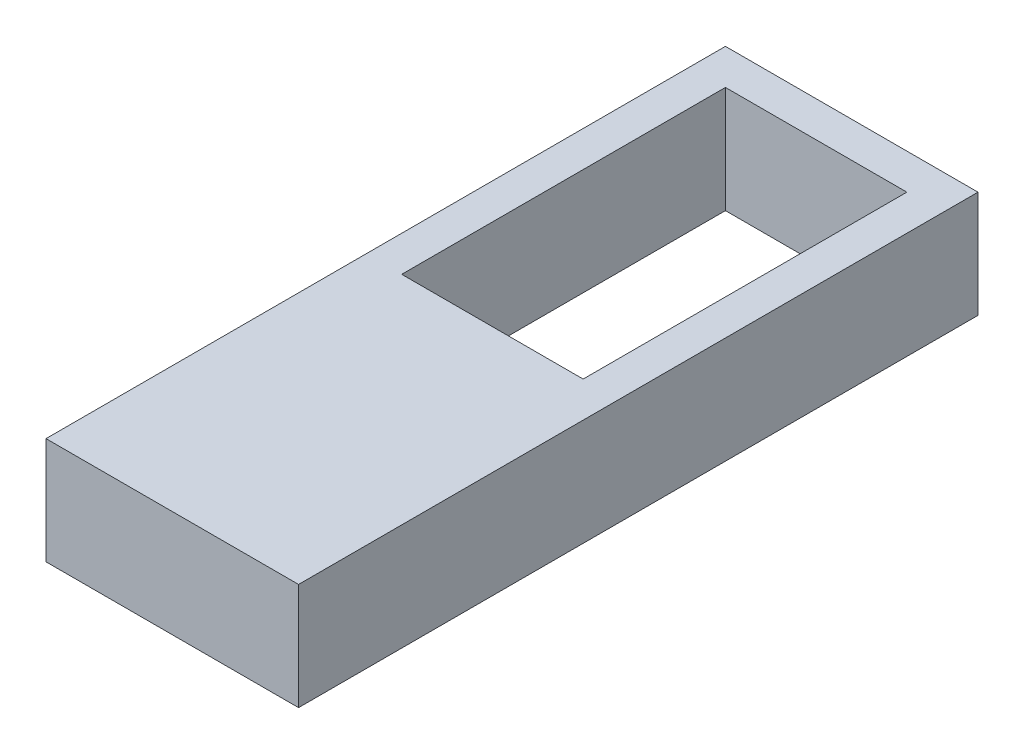
ISO-10303-21;
HEADER;
FILE_DESCRIPTION(('STEP AP214'),'2;1');
FILE_NAME('part.step','',(''),(''),'','','');
FILE_SCHEMA(('AUTOMOTIVE_DESIGN { 1 0 10303 214 1 1 1 1 }'));
ENDSEC;
DATA;
#1=APPLICATION_CONTEXT('core data for automotive mechanical design processes');
#2=APPLICATION_PROTOCOL_DEFINITION('international standard','automotive_design',2000,#1);
#3=PRODUCT_CONTEXT('',#1,'mechanical');
#4=PRODUCT('Part','Part','',(#3));
#5=PRODUCT_RELATED_PRODUCT_CATEGORY('part','',(#4));
#6=PRODUCT_DEFINITION_FORMATION('','',#4);
#7=PRODUCT_DEFINITION_CONTEXT('part definition',#1,'design');
#8=PRODUCT_DEFINITION('design','',#6,#7);
#9=PRODUCT_DEFINITION_SHAPE('','',#8);
#10=(LENGTH_UNIT() NAMED_UNIT(*) SI_UNIT(.MILLI.,.METRE.));
#11=(NAMED_UNIT(*) PLANE_ANGLE_UNIT() SI_UNIT($,.RADIAN.));
#12=(NAMED_UNIT(*) SI_UNIT($,.STERADIAN.) SOLID_ANGLE_UNIT());
#13=UNCERTAINTY_MEASURE_WITH_UNIT(LENGTH_MEASURE(1.E-05),#10,'distance_accuracy_value','');
#14=(GEOMETRIC_REPRESENTATION_CONTEXT(3) GLOBAL_UNCERTAINTY_ASSIGNED_CONTEXT((#13)) GLOBAL_UNIT_ASSIGNED_CONTEXT((#10,
#11,#12)) REPRESENTATION_CONTEXT('',''));
#15=CARTESIAN_POINT('',(0.,0.,0.));
#16=DIRECTION('',(0.,0.,1.));
#17=DIRECTION('',(1.,0.,0.));
#18=AXIS2_PLACEMENT_3D('',#15,#16,#17);
#19=CARTESIAN_POINT('',(0.,3.,-1.));
#20=DIRECTION('',(0.,0.,-1.));
#21=DIRECTION('',(-1.,0.,0.));
#22=AXIS2_PLACEMENT_3D('',#19,#20,#21);
#23=PLANE('',#22);
#24=DIRECTION('',(1.,0.,0.));
#25=VECTOR('',#24,1.);
#26=CARTESIAN_POINT('',(0.,0.,-1.));
#27=LINE('',#26,#25);
#28=CARTESIAN_POINT('',(-1.,0.,-1.));
#29=VERTEX_POINT('',#28);
#30=CARTESIAN_POINT('',(6.1,0.,-1.));
#31=VERTEX_POINT('',#30);
#32=EDGE_CURVE('E149',#29,#31,#27,.T.);
#33=ORIENTED_EDGE('',*,*,#32,.F.);
#34=DIRECTION('',(0.,-1.,0.));
#35=VECTOR('',#34,1.);
#36=CARTESIAN_POINT('',(-1.,3.,-1.));
#37=LINE('',#36,#35);
#38=CARTESIAN_POINT('',(-1.,3.,-1.));
#39=VERTEX_POINT('',#38);
#40=EDGE_CURVE('E11',#39,#29,#37,.T.);
#41=ORIENTED_EDGE('',*,*,#40,.F.);
#42=DIRECTION('',(1.,0.,0.));
#43=VECTOR('',#42,1.);
#44=CARTESIAN_POINT('',(0.,3.,-1.));
#45=LINE('',#44,#43);
#46=CARTESIAN_POINT('',(6.1,3.,-1.));
#47=VERTEX_POINT('',#46);
#48=EDGE_CURVE('E121',#39,#47,#45,.T.);
#49=ORIENTED_EDGE('',*,*,#48,.T.);
#50=DIRECTION('',(0.,-1.,0.));
#51=VECTOR('',#50,1.);
#52=CARTESIAN_POINT('',(6.1,3.,-1.));
#53=LINE('',#52,#51);
#54=EDGE_CURVE('E54',#47,#31,#53,.T.);
#55=ORIENTED_EDGE('',*,*,#54,.T.);
#56=EDGE_LOOP('',(#33,#41,#49,#55));
#57=FACE_BOUND('',#56,.T.);
#58=ADVANCED_FACE('F35',(#57),#23,.T.);
#59=CARTESIAN_POINT('',(-1.,3.,0.));
#60=DIRECTION('',(1.,0.,0.));
#61=DIRECTION('',(0.,0.,-1.));
#62=AXIS2_PLACEMENT_3D('',#59,#60,#61);
#63=PLANE('',#62);
#64=DIRECTION('',(0.,0.,1.));
#65=VECTOR('',#64,1.);
#66=CARTESIAN_POINT('',(-1.,0.,0.));
#67=LINE('',#66,#65);
#68=CARTESIAN_POINT('',(-0.999999999999998,0.,18.1));
#69=VERTEX_POINT('',#68);
#70=EDGE_CURVE('E126',#29,#69,#67,.T.);
#71=ORIENTED_EDGE('',*,*,#70,.T.);
#72=DIRECTION('',(0.,-1.,0.));
#73=VECTOR('',#72,1.);
#74=CARTESIAN_POINT('',(-0.999999999999998,3.,18.1));
#75=LINE('',#74,#73);
#76=CARTESIAN_POINT('',(-0.999999999999998,3.,18.1));
#77=VERTEX_POINT('',#76);
#78=EDGE_CURVE('E45',#77,#69,#75,.T.);
#79=ORIENTED_EDGE('',*,*,#78,.F.);
#80=DIRECTION('',(0.,0.,1.));
#81=VECTOR('',#80,1.);
#82=CARTESIAN_POINT('',(-1.,3.,0.));
#83=LINE('',#82,#81);
#84=EDGE_CURVE('E116',#39,#77,#83,.T.);
#85=ORIENTED_EDGE('',*,*,#84,.F.);
#86=ORIENTED_EDGE('',*,*,#40,.T.);
#87=EDGE_LOOP('',(#71,#79,#85,#86));
#88=FACE_BOUND('',#87,.T.);
#89=ADVANCED_FACE('F124',(#88),#63,.F.);
#90=CARTESIAN_POINT('',(0.,3.,18.1));
#91=DIRECTION('',(0.,0.,-1.));
#92=DIRECTION('',(-1.,0.,0.));
#93=AXIS2_PLACEMENT_3D('',#90,#91,#92);
#94=PLANE('',#93);
#95=DIRECTION('',(1.,0.,0.));
#96=VECTOR('',#95,1.);
#97=CARTESIAN_POINT('',(0.,0.,18.1));
#98=LINE('',#97,#96);
#99=CARTESIAN_POINT('',(6.1,0.,18.1));
#100=VERTEX_POINT('',#99);
#101=EDGE_CURVE('E146',#69,#100,#98,.T.);
#102=ORIENTED_EDGE('',*,*,#101,.T.);
#103=DIRECTION('',(0.,-1.,0.));
#104=VECTOR('',#103,1.);
#105=CARTESIAN_POINT('',(6.1,3.,18.1));
#106=LINE('',#105,#104);
#107=CARTESIAN_POINT('',(6.1,3.,18.1));
#108=VERTEX_POINT('',#107);
#109=EDGE_CURVE('E80',#108,#100,#106,.T.);
#110=ORIENTED_EDGE('',*,*,#109,.F.);
#111=DIRECTION('',(1.,0.,0.));
#112=VECTOR('',#111,1.);
#113=CARTESIAN_POINT('',(0.,3.,18.1));
#114=LINE('',#113,#112);
#115=EDGE_CURVE('E108',#77,#108,#114,.T.);
#116=ORIENTED_EDGE('',*,*,#115,.F.);
#117=ORIENTED_EDGE('',*,*,#78,.T.);
#118=EDGE_LOOP('',(#102,#110,#116,#117));
#119=FACE_BOUND('',#118,.T.);
#120=ADVANCED_FACE('F110',(#119),#94,.F.);
#121=CARTESIAN_POINT('',(0.,3.,0.));
#122=DIRECTION('',(0.,0.,-1.));
#123=DIRECTION('',(-1.,0.,0.));
#124=AXIS2_PLACEMENT_3D('',#121,#122,#123);
#125=PLANE('',#124);
#126=DIRECTION('',(1.,0.,0.));
#127=VECTOR('',#126,1.);
#128=CARTESIAN_POINT('',(0.,0.,0.));
#129=LINE('',#128,#127);
#130=CARTESIAN_POINT('',(0.,0.,0.));
#131=VERTEX_POINT('',#130);
#132=CARTESIAN_POINT('',(5.1,0.,0.));
#133=VERTEX_POINT('',#132);
#134=EDGE_CURVE('E159',#131,#133,#129,.T.);
#135=ORIENTED_EDGE('',*,*,#134,.T.);
#136=DIRECTION('',(0.,-1.,0.));
#137=VECTOR('',#136,1.);
#138=CARTESIAN_POINT('',(5.1,3.,0.));
#139=LINE('',#138,#137);
#140=CARTESIAN_POINT('',(5.1,3.,0.));
#141=VERTEX_POINT('',#140);
#142=EDGE_CURVE('E39',#141,#133,#139,.T.);
#143=ORIENTED_EDGE('',*,*,#142,.F.);
#144=DIRECTION('',(1.,0.,0.));
#145=VECTOR('',#144,1.);
#146=CARTESIAN_POINT('',(0.,3.,0.));
#147=LINE('',#146,#145);
#148=CARTESIAN_POINT('',(0.,3.,0.));
#149=VERTEX_POINT('',#148);
#150=EDGE_CURVE('E145',#149,#141,#147,.T.);
#151=ORIENTED_EDGE('',*,*,#150,.F.);
#152=DIRECTION('',(0.,-1.,0.));
#153=VECTOR('',#152,1.);
#154=CARTESIAN_POINT('',(0.,3.,0.));
#155=LINE('',#154,#153);
#156=EDGE_CURVE('E131',#149,#131,#155,.T.);
#157=ORIENTED_EDGE('',*,*,#156,.T.);
#158=EDGE_LOOP('',(#135,#143,#151,#157));
#159=FACE_BOUND('',#158,.T.);
#160=ADVANCED_FACE('F37',(#159),#125,.F.);
#161=CARTESIAN_POINT('',(5.1,3.,0.));
#162=DIRECTION('',(1.,0.,0.));
#163=DIRECTION('',(0.,0.,-1.));
#164=AXIS2_PLACEMENT_3D('',#161,#162,#163);
#165=PLANE('',#164);
#166=DIRECTION('',(0.,0.,1.));
#167=VECTOR('',#166,1.);
#168=CARTESIAN_POINT('',(5.1,0.,0.));
#169=LINE('',#168,#167);
#170=CARTESIAN_POINT('',(5.1,0.,9.1));
#171=VERTEX_POINT('',#170);
#172=EDGE_CURVE('E157',#133,#171,#169,.T.);
#173=ORIENTED_EDGE('',*,*,#172,.T.);
#174=DIRECTION('',(0.,-1.,0.));
#175=VECTOR('',#174,1.);
#176=CARTESIAN_POINT('',(5.1,3.,9.1));
#177=LINE('',#176,#175);
#178=CARTESIAN_POINT('',(5.1,3.,9.1));
#179=VERTEX_POINT('',#178);
#180=EDGE_CURVE('E134',#179,#171,#177,.T.);
#181=ORIENTED_EDGE('',*,*,#180,.F.);
#182=DIRECTION('',(0.,0.,1.));
#183=VECTOR('',#182,1.);
#184=CARTESIAN_POINT('',(5.1,3.,0.));
#185=LINE('',#184,#183);
#186=EDGE_CURVE('E93',#141,#179,#185,.T.);
#187=ORIENTED_EDGE('',*,*,#186,.F.);
#188=ORIENTED_EDGE('',*,*,#142,.T.);
#189=EDGE_LOOP('',(#173,#181,#187,#188));
#190=FACE_BOUND('',#189,.T.);
#191=ADVANCED_FACE('F183',(#190),#165,.F.);
#192=CARTESIAN_POINT('',(0.,3.,9.1));
#193=DIRECTION('',(0.,0.,-1.));
#194=DIRECTION('',(-1.,0.,0.));
#195=AXIS2_PLACEMENT_3D('',#192,#193,#194);
#196=PLANE('',#195);
#197=DIRECTION('',(1.,0.,0.));
#198=VECTOR('',#197,1.);
#199=CARTESIAN_POINT('',(0.,0.,9.1));
#200=LINE('',#199,#198);
#201=CARTESIAN_POINT('',(0.,0.,9.1));
#202=VERTEX_POINT('',#201);
#203=EDGE_CURVE('E154',#202,#171,#200,.T.);
#204=ORIENTED_EDGE('',*,*,#203,.F.);
#205=DIRECTION('',(0.,-1.,0.));
#206=VECTOR('',#205,1.);
#207=CARTESIAN_POINT('',(0.,3.,9.1));
#208=LINE('',#207,#206);
#209=CARTESIAN_POINT('',(0.,3.,9.1));
#210=VERTEX_POINT('',#209);
#211=EDGE_CURVE('E133',#210,#202,#208,.T.);
#212=ORIENTED_EDGE('',*,*,#211,.F.);
#213=DIRECTION('',(1.,0.,0.));
#214=VECTOR('',#213,1.);
#215=CARTESIAN_POINT('',(0.,3.,9.1));
#216=LINE('',#215,#214);
#217=EDGE_CURVE('E166',#210,#179,#216,.T.);
#218=ORIENTED_EDGE('',*,*,#217,.T.);
#219=ORIENTED_EDGE('',*,*,#180,.T.);
#220=EDGE_LOOP('',(#204,#212,#218,#219));
#221=FACE_BOUND('',#220,.T.);
#222=ADVANCED_FACE('F181',(#221),#196,.T.);
#223=CARTESIAN_POINT('',(0.,3.,0.));
#224=DIRECTION('',(1.,0.,0.));
#225=DIRECTION('',(0.,0.,-1.));
#226=AXIS2_PLACEMENT_3D('',#223,#224,#225);
#227=PLANE('',#226);
#228=DIRECTION('',(0.,0.,1.));
#229=VECTOR('',#228,1.);
#230=CARTESIAN_POINT('',(0.,0.,0.));
#231=LINE('',#230,#229);
#232=EDGE_CURVE('E151',#131,#202,#231,.T.);
#233=ORIENTED_EDGE('',*,*,#232,.F.);
#234=ORIENTED_EDGE('',*,*,#156,.F.);
#235=DIRECTION('',(0.,0.,1.));
#236=VECTOR('',#235,1.);
#237=CARTESIAN_POINT('',(0.,3.,0.));
#238=LINE('',#237,#236);
#239=EDGE_CURVE('E163',#149,#210,#238,.T.);
#240=ORIENTED_EDGE('',*,*,#239,.T.);
#241=ORIENTED_EDGE('',*,*,#211,.T.);
#242=EDGE_LOOP('',(#233,#234,#240,#241));
#243=FACE_BOUND('',#242,.T.);
#244=ADVANCED_FACE('F180',(#243),#227,.T.);
#245=CARTESIAN_POINT('',(6.1,3.,0.));
#246=DIRECTION('',(1.,0.,0.));
#247=DIRECTION('',(0.,0.,-1.));
#248=AXIS2_PLACEMENT_3D('',#245,#246,#247);
#249=PLANE('',#248);
#250=DIRECTION('',(0.,0.,1.));
#251=VECTOR('',#250,1.);
#252=CARTESIAN_POINT('',(6.1,0.,0.));
#253=LINE('',#252,#251);
#254=EDGE_CURVE('E142',#31,#100,#253,.T.);
#255=ORIENTED_EDGE('',*,*,#254,.F.);
#256=ORIENTED_EDGE('',*,*,#54,.F.);
#257=DIRECTION('',(0.,0.,1.));
#258=VECTOR('',#257,1.);
#259=CARTESIAN_POINT('',(6.1,3.,0.));
#260=LINE('',#259,#258);
#261=EDGE_CURVE('E115',#47,#108,#260,.T.);
#262=ORIENTED_EDGE('',*,*,#261,.T.);
#263=ORIENTED_EDGE('',*,*,#109,.T.);
#264=EDGE_LOOP('',(#255,#256,#262,#263));
#265=FACE_BOUND('',#264,.T.);
#266=ADVANCED_FACE('F189',(#265),#249,.T.);
#267=CARTESIAN_POINT('',(0.,3.,0.));
#268=DIRECTION('',(0.,1.,0.));
#269=DIRECTION('',(0.,0.,1.));
#270=AXIS2_PLACEMENT_3D('',#267,#268,#269);
#271=PLANE('',#270);
#272=ORIENTED_EDGE('',*,*,#150,.T.);
#273=ORIENTED_EDGE('',*,*,#186,.T.);
#274=ORIENTED_EDGE('',*,*,#217,.F.);
#275=ORIENTED_EDGE('',*,*,#239,.F.);
#276=EDGE_LOOP('',(#272,#273,#274,#275));
#277=FACE_BOUND('',#276,.T.);
#278=ORIENTED_EDGE('',*,*,#48,.F.);
#279=ORIENTED_EDGE('',*,*,#84,.T.);
#280=ORIENTED_EDGE('',*,*,#115,.T.);
#281=ORIENTED_EDGE('',*,*,#261,.F.);
#282=EDGE_LOOP('',(#278,#279,#280,#281));
#283=FACE_BOUND('',#282,.T.);
#284=ADVANCED_FACE('F120',(#277,#283),#271,.T.);
#285=CARTESIAN_POINT('',(0.,0.,0.));
#286=DIRECTION('',(0.,1.,0.));
#287=DIRECTION('',(0.,0.,1.));
#288=AXIS2_PLACEMENT_3D('',#285,#286,#287);
#289=PLANE('',#288);
#290=ORIENTED_EDGE('',*,*,#134,.F.);
#291=ORIENTED_EDGE('',*,*,#232,.T.);
#292=ORIENTED_EDGE('',*,*,#203,.T.);
#293=ORIENTED_EDGE('',*,*,#172,.F.);
#294=EDGE_LOOP('',(#290,#291,#292,#293));
#295=FACE_BOUND('',#294,.T.);
#296=ORIENTED_EDGE('',*,*,#32,.T.);
#297=ORIENTED_EDGE('',*,*,#254,.T.);
#298=ORIENTED_EDGE('',*,*,#101,.F.);
#299=ORIENTED_EDGE('',*,*,#70,.F.);
#300=EDGE_LOOP('',(#296,#297,#298,#299));
#301=FACE_BOUND('',#300,.T.);
#302=ADVANCED_FACE('F177',(#295,#301),#289,.F.);
#303=CLOSED_SHELL('',(#58,#89,#120,#160,#191,#222,#244,#266,#284,#302));
#304=MANIFOLD_SOLID_BREP('B2',#303);
#305=ADVANCED_BREP_SHAPE_REPRESENTATION('',(#18,#304),#14);
#306=SHAPE_DEFINITION_REPRESENTATION(#9,#305);
ENDSEC;
END-ISO-10303-21;
